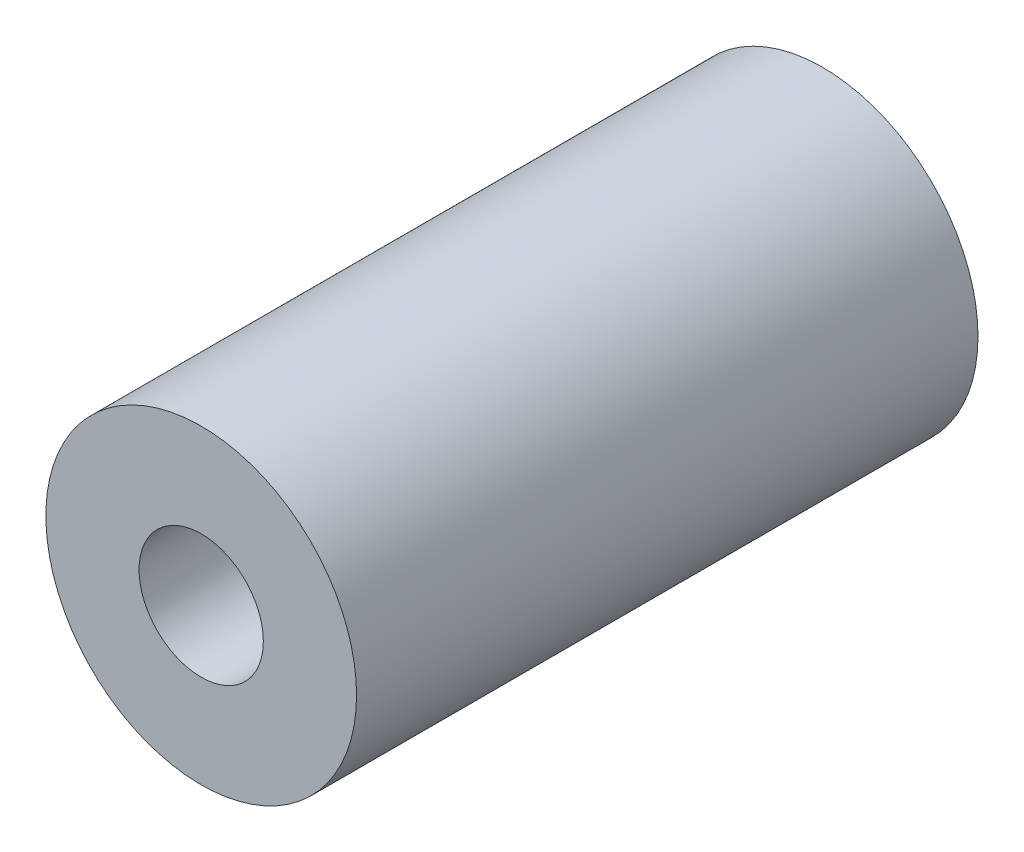
ISO-10303-21;
HEADER;
FILE_DESCRIPTION(('STEP AP214'),'2;1');
FILE_NAME('part.step','',(''),(''),'','','');
FILE_SCHEMA(('AUTOMOTIVE_DESIGN { 1 0 10303 214 1 1 1 1 }'));
ENDSEC;
DATA;
#1=APPLICATION_CONTEXT('core data for automotive mechanical design processes');
#2=APPLICATION_PROTOCOL_DEFINITION('international standard','automotive_design',2000,#1);
#3=PRODUCT_CONTEXT('',#1,'mechanical');
#4=PRODUCT('Part','Part','',(#3));
#5=PRODUCT_RELATED_PRODUCT_CATEGORY('part','',(#4));
#6=PRODUCT_DEFINITION_FORMATION('','',#4);
#7=PRODUCT_DEFINITION_CONTEXT('part definition',#1,'design');
#8=PRODUCT_DEFINITION('design','',#6,#7);
#9=PRODUCT_DEFINITION_SHAPE('','',#8);
#10=(LENGTH_UNIT() NAMED_UNIT(*) SI_UNIT(.MILLI.,.METRE.));
#11=(NAMED_UNIT(*) PLANE_ANGLE_UNIT() SI_UNIT($,.RADIAN.));
#12=(NAMED_UNIT(*) SI_UNIT($,.STERADIAN.) SOLID_ANGLE_UNIT());
#13=UNCERTAINTY_MEASURE_WITH_UNIT(LENGTH_MEASURE(1.E-05),#10,'distance_accuracy_value','');
#14=(GEOMETRIC_REPRESENTATION_CONTEXT(3) GLOBAL_UNCERTAINTY_ASSIGNED_CONTEXT((#13)) GLOBAL_UNIT_ASSIGNED_CONTEXT((#10,
#11,#12)) REPRESENTATION_CONTEXT('',''));
#15=CARTESIAN_POINT('',(0.,0.,0.));
#16=DIRECTION('',(0.,0.,1.));
#17=DIRECTION('',(1.,0.,0.));
#18=AXIS2_PLACEMENT_3D('',#15,#16,#17);
#19=CARTESIAN_POINT('',(0.,0.,20.));
#20=DIRECTION('',(0.,0.,1.));
#21=DIRECTION('',(1.,0.,0.));
#22=AXIS2_PLACEMENT_3D('',#19,#20,#21);
#23=PLANE('',#22);
#24=CARTESIAN_POINT('',(0.,0.,20.));
#25=DIRECTION('',(0.,0.,1.));
#26=DIRECTION('',(1.,0.,0.));
#27=AXIS2_PLACEMENT_3D('',#24,#25,#26);
#28=CIRCLE('',#27,5.);
#29=CARTESIAN_POINT('',(5.,0.,20.));
#30=VERTEX_POINT('',#29);
#31=EDGE_CURVE('E10',#30,#30,#28,.T.);
#32=ORIENTED_EDGE('',*,*,#31,.T.);
#33=EDGE_LOOP('',(#32));
#34=FACE_BOUND('',#33,.T.);
#35=CARTESIAN_POINT('',(0.,0.,20.));
#36=DIRECTION('',(0.,0.,1.));
#37=DIRECTION('',(1.,0.,0.));
#38=AXIS2_PLACEMENT_3D('',#35,#36,#37);
#39=CIRCLE('',#38,2.);
#40=CARTESIAN_POINT('',(2.,0.,20.));
#41=VERTEX_POINT('',#40);
#42=EDGE_CURVE('E44',#41,#41,#39,.T.);
#43=ORIENTED_EDGE('',*,*,#42,.F.);
#44=EDGE_LOOP('',(#43));
#45=FACE_BOUND('',#44,.T.);
#46=ADVANCED_FACE('F33',(#34,#45),#23,.T.);
#47=CARTESIAN_POINT('',(0.,0.,0.));
#48=DIRECTION('',(0.,0.,1.));
#49=DIRECTION('',(1.,0.,0.));
#50=AXIS2_PLACEMENT_3D('',#47,#48,#49);
#51=PLANE('',#50);
#52=CARTESIAN_POINT('',(0.,0.,0.));
#53=DIRECTION('',(0.,0.,1.));
#54=DIRECTION('',(1.,0.,0.));
#55=AXIS2_PLACEMENT_3D('',#52,#53,#54);
#56=CIRCLE('',#55,5.);
#57=CARTESIAN_POINT('',(5.,0.,0.));
#58=VERTEX_POINT('',#57);
#59=EDGE_CURVE('E37',#58,#58,#56,.T.);
#60=ORIENTED_EDGE('',*,*,#59,.F.);
#61=EDGE_LOOP('',(#60));
#62=FACE_BOUND('',#61,.T.);
#63=CARTESIAN_POINT('',(0.,0.,0.));
#64=DIRECTION('',(0.,0.,1.));
#65=DIRECTION('',(1.,0.,0.));
#66=AXIS2_PLACEMENT_3D('',#63,#64,#65);
#67=CIRCLE('',#66,2.);
#68=CARTESIAN_POINT('',(2.,0.,0.));
#69=VERTEX_POINT('',#68);
#70=EDGE_CURVE('E46',#69,#69,#67,.T.);
#71=ORIENTED_EDGE('',*,*,#70,.T.);
#72=EDGE_LOOP('',(#71));
#73=FACE_BOUND('',#72,.T.);
#74=ADVANCED_FACE('F56',(#62,#73),#51,.F.);
#75=CARTESIAN_POINT('',(0.,0.,20.));
#76=DIRECTION('',(0.,0.,-1.));
#77=DIRECTION('',(-1.,0.,0.));
#78=AXIS2_PLACEMENT_3D('',#75,#76,#77);
#79=CYLINDRICAL_SURFACE('',#78,5.);
#80=ORIENTED_EDGE('',*,*,#31,.F.);
#81=EDGE_LOOP('',(#80));
#82=FACE_BOUND('',#81,.T.);
#83=ORIENTED_EDGE('',*,*,#59,.T.);
#84=EDGE_LOOP('',(#83));
#85=FACE_BOUND('',#84,.T.);
#86=ADVANCED_FACE('F35',(#82,#85),#79,.T.);
#87=CARTESIAN_POINT('',(0.,0.,20.));
#88=DIRECTION('',(0.,0.,-1.));
#89=DIRECTION('',(-1.,0.,0.));
#90=AXIS2_PLACEMENT_3D('',#87,#88,#89);
#91=CYLINDRICAL_SURFACE('',#90,2.);
#92=ORIENTED_EDGE('',*,*,#42,.T.);
#93=EDGE_LOOP('',(#92));
#94=FACE_BOUND('',#93,.T.);
#95=ORIENTED_EDGE('',*,*,#70,.F.);
#96=EDGE_LOOP('',(#95));
#97=FACE_BOUND('',#96,.T.);
#98=ADVANCED_FACE('F52',(#94,#97),#91,.F.);
#99=CLOSED_SHELL('',(#46,#74,#86,#98));
#100=MANIFOLD_SOLID_BREP('B2',#99);
#101=ADVANCED_BREP_SHAPE_REPRESENTATION('',(#18,#100),#14);
#102=SHAPE_DEFINITION_REPRESENTATION(#9,#101);
ENDSEC;
END-ISO-10303-21;
